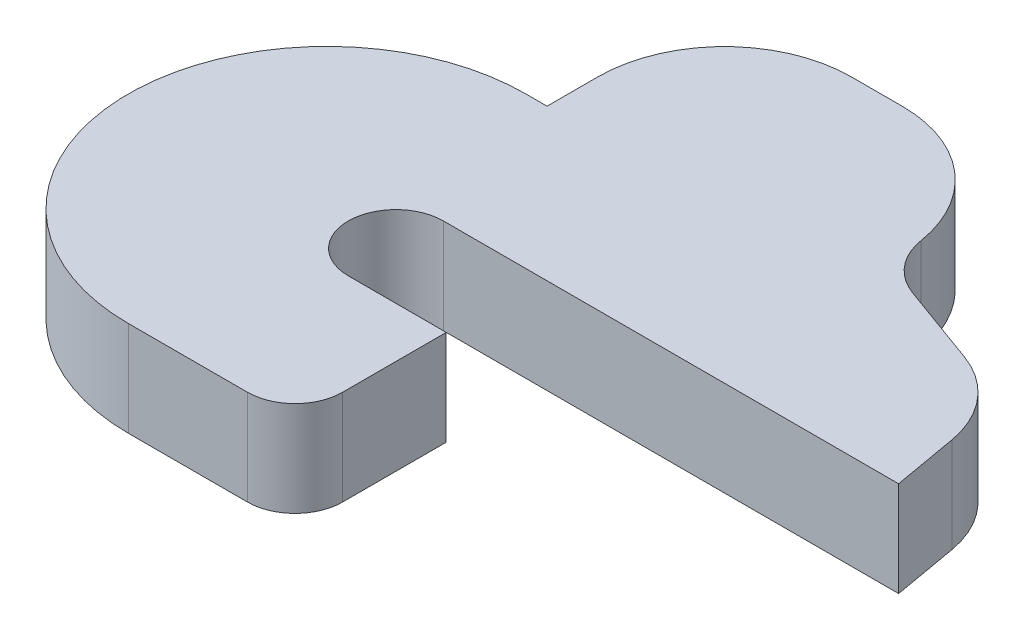
ISO-10303-21;
HEADER;
FILE_DESCRIPTION(('STEP AP214'),'2;1');
FILE_NAME('part.step','',(''),(''),'','','');
FILE_SCHEMA(('AUTOMOTIVE_DESIGN { 1 0 10303 214 1 1 1 1 }'));
ENDSEC;
DATA;
#1=APPLICATION_CONTEXT('core data for automotive mechanical design processes');
#2=APPLICATION_PROTOCOL_DEFINITION('international standard','automotive_design',2000,#1);
#3=PRODUCT_CONTEXT('',#1,'mechanical');
#4=PRODUCT('Part','Part','',(#3));
#5=PRODUCT_RELATED_PRODUCT_CATEGORY('part','',(#4));
#6=PRODUCT_DEFINITION_FORMATION('','',#4);
#7=PRODUCT_DEFINITION_CONTEXT('part definition',#1,'design');
#8=PRODUCT_DEFINITION('design','',#6,#7);
#9=PRODUCT_DEFINITION_SHAPE('','',#8);
#10=(LENGTH_UNIT() NAMED_UNIT(*) SI_UNIT(.MILLI.,.METRE.));
#11=(NAMED_UNIT(*) PLANE_ANGLE_UNIT() SI_UNIT($,.RADIAN.));
#12=(NAMED_UNIT(*) SI_UNIT($,.STERADIAN.) SOLID_ANGLE_UNIT());
#13=UNCERTAINTY_MEASURE_WITH_UNIT(LENGTH_MEASURE(1.E-05),#10,'distance_accuracy_value','');
#14=(GEOMETRIC_REPRESENTATION_CONTEXT(3) GLOBAL_UNCERTAINTY_ASSIGNED_CONTEXT((#13)) GLOBAL_UNIT_ASSIGNED_CONTEXT((#10,
#11,#12)) REPRESENTATION_CONTEXT('',''));
#15=CARTESIAN_POINT('',(0.,0.,0.));
#16=DIRECTION('',(0.,0.,1.));
#17=DIRECTION('',(1.,0.,0.));
#18=AXIS2_PLACEMENT_3D('',#15,#16,#17);
#19=CARTESIAN_POINT('',(0.,3.,3.27));
#20=DIRECTION('',(-1.,0.,0.));
#21=DIRECTION('',(0.,0.,1.));
#22=AXIS2_PLACEMENT_3D('',#19,#20,#21);
#23=PLANE('',#22);
#24=DIRECTION('',(0.,0.,-1.));
#25=VECTOR('',#24,1.);
#26=CARTESIAN_POINT('',(0.,0.,3.27));
#27=LINE('',#26,#25);
#28=CARTESIAN_POINT('',(0.,0.,3.27));
#29=VERTEX_POINT('',#28);
#30=CARTESIAN_POINT('',(0.,0.,0.));
#31=VERTEX_POINT('',#30);
#32=EDGE_CURVE('E177',#29,#31,#27,.T.);
#33=ORIENTED_EDGE('',*,*,#32,.T.);
#34=DIRECTION('',(0.,-1.,0.));
#35=VECTOR('',#34,1.);
#36=CARTESIAN_POINT('',(0.,3.,0.));
#37=LINE('',#36,#35);
#38=CARTESIAN_POINT('',(0.,3.,0.));
#39=VERTEX_POINT('',#38);
#40=EDGE_CURVE('E11',#39,#31,#37,.T.);
#41=ORIENTED_EDGE('',*,*,#40,.F.);
#42=DIRECTION('',(0.,0.,-1.));
#43=VECTOR('',#42,1.);
#44=CARTESIAN_POINT('',(0.,3.,3.27));
#45=LINE('',#44,#43);
#46=CARTESIAN_POINT('',(0.,3.,3.27));
#47=VERTEX_POINT('',#46);
#48=EDGE_CURVE('E207',#47,#39,#45,.T.);
#49=ORIENTED_EDGE('',*,*,#48,.F.);
#50=DIRECTION('',(0.,-1.,0.));
#51=VECTOR('',#50,1.);
#52=CARTESIAN_POINT('',(0.,3.,3.27));
#53=LINE('',#52,#51);
#54=EDGE_CURVE('E173',#47,#29,#53,.T.);
#55=ORIENTED_EDGE('',*,*,#54,.T.);
#56=EDGE_LOOP('',(#33,#41,#49,#55));
#57=FACE_BOUND('',#56,.T.);
#58=ADVANCED_FACE('F33',(#57),#23,.F.);
#59=CARTESIAN_POINT('',(0.,3.,0.));
#60=DIRECTION('',(0.,0.,1.));
#61=DIRECTION('',(1.,0.,0.));
#62=AXIS2_PLACEMENT_3D('',#59,#60,#61);
#63=PLANE('',#62);
#64=DIRECTION('',(-1.,0.,0.));
#65=VECTOR('',#64,1.);
#66=CARTESIAN_POINT('',(0.,0.,0.));
#67=LINE('',#66,#65);
#68=CARTESIAN_POINT('',(-3.09,0.,0.));
#69=VERTEX_POINT('',#68);
#70=EDGE_CURVE('E180',#31,#69,#67,.T.);
#71=ORIENTED_EDGE('',*,*,#70,.T.);
#72=DIRECTION('',(0.,-1.,0.));
#73=VECTOR('',#72,1.);
#74=CARTESIAN_POINT('',(-3.09,3.,0.));
#75=LINE('',#74,#73);
#76=CARTESIAN_POINT('',(-3.09,3.,0.));
#77=VERTEX_POINT('',#76);
#78=EDGE_CURVE('E41',#77,#69,#75,.T.);
#79=ORIENTED_EDGE('',*,*,#78,.F.);
#80=DIRECTION('',(-1.,0.,0.));
#81=VECTOR('',#80,1.);
#82=CARTESIAN_POINT('',(0.,3.,0.));
#83=LINE('',#82,#81);
#84=EDGE_CURVE('E116',#39,#77,#83,.T.);
#85=ORIENTED_EDGE('',*,*,#84,.F.);
#86=ORIENTED_EDGE('',*,*,#40,.T.);
#87=EDGE_LOOP('',(#71,#79,#85,#86));
#88=FACE_BOUND('',#87,.T.);
#89=ADVANCED_FACE('F305',(#88),#63,.F.);
#90=CARTESIAN_POINT('',(-3.09,3.,-1.5));
#91=DIRECTION('',(0.,-1.,0.));
#92=DIRECTION('',(0.,0.,-1.));
#93=AXIS2_PLACEMENT_3D('',#90,#91,#92);
#94=CYLINDRICAL_SURFACE('',#93,1.5);
#95=CARTESIAN_POINT('',(-3.09,0.,-1.5));
#96=DIRECTION('',(0.,-1.,0.));
#97=DIRECTION('',(0.,0.,-1.));
#98=AXIS2_PLACEMENT_3D('',#95,#96,#97);
#99=CIRCLE('',#98,1.5);
#100=CARTESIAN_POINT('',(-3.09,0.,-3.));
#101=VERTEX_POINT('',#100);
#102=EDGE_CURVE('E182',#69,#101,#99,.T.);
#103=ORIENTED_EDGE('',*,*,#102,.T.);
#104=DIRECTION('',(0.,-1.,0.));
#105=VECTOR('',#104,1.);
#106=CARTESIAN_POINT('',(-3.09,3.,-3.));
#107=LINE('',#106,#105);
#108=CARTESIAN_POINT('',(-3.09,3.,-3.));
#109=VERTEX_POINT('',#108);
#110=EDGE_CURVE('E238',#109,#101,#107,.T.);
#111=ORIENTED_EDGE('',*,*,#110,.F.);
#112=CARTESIAN_POINT('',(-3.09,3.,-1.5));
#113=DIRECTION('',(0.,-1.,0.));
#114=DIRECTION('',(0.,0.,-1.));
#115=AXIS2_PLACEMENT_3D('',#112,#113,#114);
#116=CIRCLE('',#115,1.5);
#117=EDGE_CURVE('E246',#77,#109,#116,.T.);
#118=ORIENTED_EDGE('',*,*,#117,.F.);
#119=ORIENTED_EDGE('',*,*,#78,.T.);
#120=EDGE_LOOP('',(#103,#111,#118,#119));
#121=FACE_BOUND('',#120,.T.);
#122=ADVANCED_FACE('F244',(#121),#94,.F.);
#123=CARTESIAN_POINT('',(-3.09,3.,-3.));
#124=DIRECTION('',(0.,0.,-1.));
#125=DIRECTION('',(-1.,0.,0.));
#126=AXIS2_PLACEMENT_3D('',#123,#124,#125);
#127=PLANE('',#126);
#128=DIRECTION('',(1.,0.,0.));
#129=VECTOR('',#128,1.);
#130=CARTESIAN_POINT('',(-3.09,0.,-3.));
#131=LINE('',#130,#129);
#132=CARTESIAN_POINT('',(11.27,0.,-3.));
#133=VERTEX_POINT('',#132);
#134=EDGE_CURVE('E184',#101,#133,#131,.T.);
#135=ORIENTED_EDGE('',*,*,#134,.T.);
#136=DIRECTION('',(0.,-1.,0.));
#137=VECTOR('',#136,1.);
#138=CARTESIAN_POINT('',(11.27,3.,-3.));
#139=LINE('',#138,#137);
#140=CARTESIAN_POINT('',(11.27,3.,-3.));
#141=VERTEX_POINT('',#140);
#142=EDGE_CURVE('E235',#141,#133,#139,.T.);
#143=ORIENTED_EDGE('',*,*,#142,.F.);
#144=DIRECTION('',(1.,0.,0.));
#145=VECTOR('',#144,1.);
#146=CARTESIAN_POINT('',(-3.09,3.,-3.));
#147=LINE('',#146,#145);
#148=EDGE_CURVE('E264',#109,#141,#147,.T.);
#149=ORIENTED_EDGE('',*,*,#148,.F.);
#150=ORIENTED_EDGE('',*,*,#110,.T.);
#151=EDGE_LOOP('',(#135,#143,#149,#150));
#152=FACE_BOUND('',#151,.T.);
#153=ADVANCED_FACE('F255',(#152),#127,.F.);
#154=CARTESIAN_POINT('',(11.27,3.,-3.));
#155=DIRECTION('',(-0.984807753012207,0.,0.173648177666936));
#156=DIRECTION('',(0.173648177666936,0.,0.984807753012207));
#157=AXIS2_PLACEMENT_3D('',#154,#155,#156);
#158=PLANE('',#157);
#159=DIRECTION('',(-0.173648177666936,0.,-0.984807753012207));
#160=VECTOR('',#159,1.);
#161=CARTESIAN_POINT('',(11.27,0.,-3.));
#162=LINE('',#161,#160);
#163=CARTESIAN_POINT('',(10.9088221154867,0.,-5.04834157008812));
#164=VERTEX_POINT('',#163);
#165=EDGE_CURVE('E186',#133,#164,#162,.T.);
#166=ORIENTED_EDGE('',*,*,#165,.T.);
#167=DIRECTION('',(0.,-1.,0.));
#168=VECTOR('',#167,1.);
#169=CARTESIAN_POINT('',(10.9088221154867,3.,-5.04834157008812));
#170=LINE('',#169,#168);
#171=CARTESIAN_POINT('',(10.9088221154867,3.,-5.04834157008812));
#172=VERTEX_POINT('',#171);
#173=EDGE_CURVE('E232',#172,#164,#170,.T.);
#174=ORIENTED_EDGE('',*,*,#173,.F.);
#175=DIRECTION('',(-0.173648177666936,0.,-0.984807753012207));
#176=VECTOR('',#175,1.);
#177=CARTESIAN_POINT('',(11.27,3.,-3.));
#178=LINE('',#177,#176);
#179=EDGE_CURVE('E261',#141,#172,#178,.T.);
#180=ORIENTED_EDGE('',*,*,#179,.F.);
#181=ORIENTED_EDGE('',*,*,#142,.T.);
#182=EDGE_LOOP('',(#166,#174,#180,#181));
#183=FACE_BOUND('',#182,.T.);
#184=ADVANCED_FACE('F259',(#183),#158,.F.);
#185=CARTESIAN_POINT('',(7.75743730584765,3.,-4.49266740155393));
#186=DIRECTION('',(0.,-1.,0.));
#187=DIRECTION('',(0.,0.,-1.));
#188=AXIS2_PLACEMENT_3D('',#185,#186,#187);
#189=CYLINDRICAL_SURFACE('',#188,3.2);
#190=CARTESIAN_POINT('',(7.75743730584765,0.,-4.49266740155393));
#191=DIRECTION('',(0.,1.,0.));
#192=DIRECTION('',(0.,0.,1.));
#193=AXIS2_PLACEMENT_3D('',#190,#191,#192);
#194=CIRCLE('',#193,3.2);
#195=CARTESIAN_POINT('',(8.85103258853848,0.,-7.5));
#196=VERTEX_POINT('',#195);
#197=EDGE_CURVE('E188',#164,#196,#194,.T.);
#198=ORIENTED_EDGE('',*,*,#197,.T.);
#199=DIRECTION('',(0.,-1.,0.));
#200=VECTOR('',#199,1.);
#201=CARTESIAN_POINT('',(8.85103258853848,3.,-7.5));
#202=LINE('',#201,#200);
#203=CARTESIAN_POINT('',(8.85103258853848,3.,-7.5));
#204=VERTEX_POINT('',#203);
#205=EDGE_CURVE('E229',#204,#196,#202,.T.);
#206=ORIENTED_EDGE('',*,*,#205,.F.);
#207=CARTESIAN_POINT('',(7.75743730584765,3.,-4.49266740155393));
#208=DIRECTION('',(0.,1.,0.));
#209=DIRECTION('',(0.,0.,1.));
#210=AXIS2_PLACEMENT_3D('',#207,#208,#209);
#211=CIRCLE('',#210,3.2);
#212=EDGE_CURVE('E263',#172,#204,#211,.T.);
#213=ORIENTED_EDGE('',*,*,#212,.F.);
#214=ORIENTED_EDGE('',*,*,#173,.T.);
#215=EDGE_LOOP('',(#198,#206,#213,#214));
#216=FACE_BOUND('',#215,.T.);
#217=ADVANCED_FACE('F318',(#216),#189,.T.);
#218=CARTESIAN_POINT('',(6.27,3.,-8.43857429163487));
#219=DIRECTION('',(-0.341748525840883,0.,0.939791437014396));
#220=DIRECTION('',(0.939791437014396,0.,0.341748525840883));
#221=AXIS2_PLACEMENT_3D('',#218,#219,#220);
#222=PLANE('',#221);
#223=DIRECTION('',(-0.939791437014396,0.,-0.341748525840883));
#224=VECTOR('',#223,1.);
#225=CARTESIAN_POINT('',(6.27,0.,-8.43857429163487));
#226=LINE('',#225,#224);
#227=CARTESIAN_POINT('',(6.27,0.,-8.43857429163487));
#228=VERTEX_POINT('',#227);
#229=EDGE_CURVE('E190',#196,#228,#226,.T.);
#230=ORIENTED_EDGE('',*,*,#229,.T.);
#231=DIRECTION('',(0.,-1.,0.));
#232=VECTOR('',#231,1.);
#233=CARTESIAN_POINT('',(6.27,3.,-8.43857429163487));
#234=LINE('',#233,#232);
#235=CARTESIAN_POINT('',(6.27,3.,-8.43857429163487));
#236=VERTEX_POINT('',#235);
#237=EDGE_CURVE('E226',#236,#228,#234,.T.);
#238=ORIENTED_EDGE('',*,*,#237,.F.);
#239=DIRECTION('',(-0.939791437014396,0.,-0.341748525840883));
#240=VECTOR('',#239,1.);
#241=CARTESIAN_POINT('',(6.27,3.,-8.43857429163487));
#242=LINE('',#241,#240);
#243=EDGE_CURVE('E266',#204,#236,#242,.T.);
#244=ORIENTED_EDGE('',*,*,#243,.F.);
#245=ORIENTED_EDGE('',*,*,#205,.T.);
#246=EDGE_LOOP('',(#230,#238,#244,#245));
#247=FACE_BOUND('',#246,.T.);
#248=ADVANCED_FACE('F321',(#247),#222,.F.);
#249=CARTESIAN_POINT('',(6.95349705168177,3.,-10.3181571656637));
#250=DIRECTION('',(0.,-1.,0.));
#251=DIRECTION('',(0.,0.,-1.));
#252=AXIS2_PLACEMENT_3D('',#249,#250,#251);
#253=CYLINDRICAL_SURFACE('',#252,2.);
#254=CARTESIAN_POINT('',(6.95349705168177,0.,-10.3181571656637));
#255=DIRECTION('',(0.,-1.,0.));
#256=DIRECTION('',(0.,0.,-1.));
#257=AXIS2_PLACEMENT_3D('',#254,#255,#256);
#258=CIRCLE('',#257,2.);
#259=CARTESIAN_POINT('',(4.97862721098619,0.,-10.0021047771091));
#260=VERTEX_POINT('',#259);
#261=EDGE_CURVE('E192',#228,#260,#258,.T.);
#262=ORIENTED_EDGE('',*,*,#261,.T.);
#263=DIRECTION('',(0.,-1.,0.));
#264=VECTOR('',#263,1.);
#265=CARTESIAN_POINT('',(4.97862721098619,3.,-10.0021047771091));
#266=LINE('',#265,#264);
#267=CARTESIAN_POINT('',(4.97862721098619,3.,-10.0021047771091));
#268=VERTEX_POINT('',#267);
#269=EDGE_CURVE('E223',#268,#260,#266,.T.);
#270=ORIENTED_EDGE('',*,*,#269,.F.);
#271=CARTESIAN_POINT('',(6.95349705168177,3.,-10.3181571656637));
#272=DIRECTION('',(0.,-1.,0.));
#273=DIRECTION('',(0.,0.,-1.));
#274=AXIS2_PLACEMENT_3D('',#271,#272,#273);
#275=CIRCLE('',#274,2.);
#276=EDGE_CURVE('E272',#236,#268,#275,.T.);
#277=ORIENTED_EDGE('',*,*,#276,.F.);
#278=ORIENTED_EDGE('',*,*,#237,.T.);
#279=EDGE_LOOP('',(#262,#270,#277,#278));
#280=FACE_BOUND('',#279,.T.);
#281=ADVANCED_FACE('F325',(#280),#253,.F.);
#282=CARTESIAN_POINT('',(1.02888752959505,3.,-9.37));
#283=DIRECTION('',(0.,-1.,0.));
#284=DIRECTION('',(0.,0.,-1.));
#285=AXIS2_PLACEMENT_3D('',#282,#283,#284);
#286=CYLINDRICAL_SURFACE('',#285,4.);
#287=CARTESIAN_POINT('',(1.02888752959505,0.,-9.37));
#288=DIRECTION('',(0.,1.,0.));
#289=DIRECTION('',(0.,0.,-1.));
#290=AXIS2_PLACEMENT_3D('',#287,#288,#289);
#291=CIRCLE('',#290,4.);
#292=CARTESIAN_POINT('',(1.02888752959505,0.,-13.37));
#293=VERTEX_POINT('',#292);
#294=EDGE_CURVE('E194',#260,#293,#291,.T.);
#295=ORIENTED_EDGE('',*,*,#294,.T.);
#296=DIRECTION('',(0.,-1.,0.));
#297=VECTOR('',#296,1.);
#298=CARTESIAN_POINT('',(1.02888752959505,3.,-13.37));
#299=LINE('',#298,#297);
#300=CARTESIAN_POINT('',(1.02888752959505,3.,-13.37));
#301=VERTEX_POINT('',#300);
#302=EDGE_CURVE('E220',#301,#293,#299,.T.);
#303=ORIENTED_EDGE('',*,*,#302,.F.);
#304=CARTESIAN_POINT('',(1.02888752959505,3.,-9.37));
#305=DIRECTION('',(0.,1.,0.));
#306=DIRECTION('',(0.,0.,-1.));
#307=AXIS2_PLACEMENT_3D('',#304,#305,#306);
#308=CIRCLE('',#307,4.);
#309=EDGE_CURVE('E274',#268,#301,#308,.T.);
#310=ORIENTED_EDGE('',*,*,#309,.F.);
#311=ORIENTED_EDGE('',*,*,#269,.T.);
#312=EDGE_LOOP('',(#295,#303,#310,#311));
#313=FACE_BOUND('',#312,.T.);
#314=ADVANCED_FACE('F329',(#313),#286,.T.);
#315=CARTESIAN_POINT('',(1.02888752959504,3.,-13.37));
#316=DIRECTION('',(0.,0.,1.));
#317=DIRECTION('',(1.,0.,0.));
#318=AXIS2_PLACEMENT_3D('',#315,#316,#317);
#319=PLANE('',#318);
#320=DIRECTION('',(-1.,0.,0.));
#321=VECTOR('',#320,1.);
#322=CARTESIAN_POINT('',(1.02888752959504,0.,-13.37));
#323=LINE('',#322,#321);
#324=CARTESIAN_POINT('',(-0.590000000000001,0.,-13.37));
#325=VERTEX_POINT('',#324);
#326=EDGE_CURVE('E196',#293,#325,#323,.T.);
#327=ORIENTED_EDGE('',*,*,#326,.T.);
#328=DIRECTION('',(0.,-1.,0.));
#329=VECTOR('',#328,1.);
#330=CARTESIAN_POINT('',(-0.590000000000001,3.,-13.37));
#331=LINE('',#330,#329);
#332=CARTESIAN_POINT('',(-0.590000000000001,3.,-13.37));
#333=VERTEX_POINT('',#332);
#334=EDGE_CURVE('E217',#333,#325,#331,.T.);
#335=ORIENTED_EDGE('',*,*,#334,.F.);
#336=DIRECTION('',(-1.,0.,0.));
#337=VECTOR('',#336,1.);
#338=CARTESIAN_POINT('',(1.02888752959504,3.,-13.37));
#339=LINE('',#338,#337);
#340=EDGE_CURVE('E276',#301,#333,#339,.T.);
#341=ORIENTED_EDGE('',*,*,#340,.F.);
#342=ORIENTED_EDGE('',*,*,#302,.T.);
#343=EDGE_LOOP('',(#327,#335,#341,#342));
#344=FACE_BOUND('',#343,.T.);
#345=ADVANCED_FACE('F333',(#344),#319,.F.);
#346=CARTESIAN_POINT('',(-0.59,3.,-9.37));
#347=DIRECTION('',(0.,-1.,0.));
#348=DIRECTION('',(0.,0.,-1.));
#349=AXIS2_PLACEMENT_3D('',#346,#347,#348);
#350=CYLINDRICAL_SURFACE('',#349,4.);
#351=CARTESIAN_POINT('',(-0.59,0.,-9.37));
#352=DIRECTION('',(0.,1.,0.));
#353=DIRECTION('',(0.,0.,1.));
#354=AXIS2_PLACEMENT_3D('',#351,#352,#353);
#355=CIRCLE('',#354,4.);
#356=CARTESIAN_POINT('',(-4.59,0.,-9.37));
#357=VERTEX_POINT('',#356);
#358=EDGE_CURVE('E198',#325,#357,#355,.T.);
#359=ORIENTED_EDGE('',*,*,#358,.T.);
#360=DIRECTION('',(0.,-1.,0.));
#361=VECTOR('',#360,1.);
#362=CARTESIAN_POINT('',(-4.59,3.,-9.37));
#363=LINE('',#362,#361);
#364=CARTESIAN_POINT('',(-4.59,3.,-9.37));
#365=VERTEX_POINT('',#364);
#366=EDGE_CURVE('E214',#365,#357,#363,.T.);
#367=ORIENTED_EDGE('',*,*,#366,.F.);
#368=CARTESIAN_POINT('',(-0.59,3.,-9.37));
#369=DIRECTION('',(0.,1.,0.));
#370=DIRECTION('',(0.,0.,1.));
#371=AXIS2_PLACEMENT_3D('',#368,#369,#370);
#372=CIRCLE('',#371,4.);
#373=EDGE_CURVE('E278',#333,#365,#372,.T.);
#374=ORIENTED_EDGE('',*,*,#373,.F.);
#375=ORIENTED_EDGE('',*,*,#334,.T.);
#376=EDGE_LOOP('',(#359,#367,#374,#375));
#377=FACE_BOUND('',#376,.T.);
#378=ADVANCED_FACE('F337',(#377),#350,.T.);
#379=CARTESIAN_POINT('',(-4.59,3.,-9.37));
#380=DIRECTION('',(1.,0.,0.));
#381=DIRECTION('',(0.,0.,-1.));
#382=AXIS2_PLACEMENT_3D('',#379,#380,#381);
#383=PLANE('',#382);
#384=DIRECTION('',(0.,0.,1.));
#385=VECTOR('',#384,1.);
#386=CARTESIAN_POINT('',(-4.59,0.,-9.37));
#387=LINE('',#386,#385);
#388=CARTESIAN_POINT('',(-4.59,0.,-7.77));
#389=VERTEX_POINT('',#388);
#390=EDGE_CURVE('E200',#357,#389,#387,.T.);
#391=ORIENTED_EDGE('',*,*,#390,.T.);
#392=DIRECTION('',(0.,-1.,0.));
#393=VECTOR('',#392,1.);
#394=CARTESIAN_POINT('',(-4.59,3.,-7.77));
#395=LINE('',#394,#393);
#396=CARTESIAN_POINT('',(-4.59,3.,-7.77));
#397=VERTEX_POINT('',#396);
#398=EDGE_CURVE('E211',#397,#389,#395,.T.);
#399=ORIENTED_EDGE('',*,*,#398,.F.);
#400=DIRECTION('',(0.,0.,1.));
#401=VECTOR('',#400,1.);
#402=CARTESIAN_POINT('',(-4.59,3.,-9.37));
#403=LINE('',#402,#401);
#404=EDGE_CURVE('E280',#365,#397,#403,.T.);
#405=ORIENTED_EDGE('',*,*,#404,.F.);
#406=ORIENTED_EDGE('',*,*,#366,.T.);
#407=EDGE_LOOP('',(#391,#399,#405,#406));
#408=FACE_BOUND('',#407,.T.);
#409=ADVANCED_FACE('F286',(#408),#383,.F.);
#410=CARTESIAN_POINT('',(-4.59,3.,-7.77));
#411=DIRECTION('',(0.,0.,1.));
#412=DIRECTION('',(1.,0.,0.));
#413=AXIS2_PLACEMENT_3D('',#410,#411,#412);
#414=PLANE('',#413);
#415=DIRECTION('',(-1.,0.,0.));
#416=VECTOR('',#415,1.);
#417=CARTESIAN_POINT('',(-4.59,0.,-7.77));
#418=LINE('',#417,#416);
#419=CARTESIAN_POINT('',(-5.26,0.,-7.77));
#420=VERTEX_POINT('',#419);
#421=EDGE_CURVE('E202',#389,#420,#418,.T.);
#422=ORIENTED_EDGE('',*,*,#421,.T.);
#423=DIRECTION('',(0.,-1.,0.));
#424=VECTOR('',#423,1.);
#425=CARTESIAN_POINT('',(-5.26,3.,-7.77));
#426=LINE('',#425,#424);
#427=CARTESIAN_POINT('',(-5.26,3.,-7.77));
#428=VERTEX_POINT('',#427);
#429=EDGE_CURVE('E168',#428,#420,#426,.T.);
#430=ORIENTED_EDGE('',*,*,#429,.F.);
#431=DIRECTION('',(-1.,0.,0.));
#432=VECTOR('',#431,1.);
#433=CARTESIAN_POINT('',(-4.59,3.,-7.77));
#434=LINE('',#433,#432);
#435=EDGE_CURVE('E159',#397,#428,#434,.T.);
#436=ORIENTED_EDGE('',*,*,#435,.F.);
#437=ORIENTED_EDGE('',*,*,#398,.T.);
#438=EDGE_LOOP('',(#422,#430,#436,#437));
#439=FACE_BOUND('',#438,.T.);
#440=ADVANCED_FACE('F290',(#439),#414,.F.);
#441=CARTESIAN_POINT('',(-5.26,3.,-1.5));
#442=DIRECTION('',(0.,-1.,0.));
#443=DIRECTION('',(0.,0.,-1.));
#444=AXIS2_PLACEMENT_3D('',#441,#442,#443);
#445=CYLINDRICAL_SURFACE('',#444,6.27);
#446=CARTESIAN_POINT('',(-5.26,0.,-1.5));
#447=DIRECTION('',(0.,1.,0.));
#448=DIRECTION('',(0.,0.,1.));
#449=AXIS2_PLACEMENT_3D('',#446,#447,#448);
#450=CIRCLE('',#449,6.27);
#451=CARTESIAN_POINT('',(-5.26,0.,4.77));
#452=VERTEX_POINT('',#451);
#453=EDGE_CURVE('E167',#420,#452,#450,.T.);
#454=ORIENTED_EDGE('',*,*,#453,.T.);
#455=DIRECTION('',(0.,-1.,0.));
#456=VECTOR('',#455,1.);
#457=CARTESIAN_POINT('',(-5.26,3.,4.77));
#458=LINE('',#457,#456);
#459=CARTESIAN_POINT('',(-5.26,3.,4.77));
#460=VERTEX_POINT('',#459);
#461=EDGE_CURVE('E164',#460,#452,#458,.T.);
#462=ORIENTED_EDGE('',*,*,#461,.F.);
#463=CARTESIAN_POINT('',(-5.26,3.,-1.5));
#464=DIRECTION('',(0.,1.,0.));
#465=DIRECTION('',(0.,0.,1.));
#466=AXIS2_PLACEMENT_3D('',#463,#464,#465);
#467=CIRCLE('',#466,6.27);
#468=EDGE_CURVE('E153',#428,#460,#467,.T.);
#469=ORIENTED_EDGE('',*,*,#468,.F.);
#470=ORIENTED_EDGE('',*,*,#429,.T.);
#471=EDGE_LOOP('',(#454,#462,#469,#470));
#472=FACE_BOUND('',#471,.T.);
#473=ADVANCED_FACE('F165',(#472),#445,.T.);
#474=CARTESIAN_POINT('',(-5.26,3.,4.77));
#475=DIRECTION('',(0.,0.,-1.));
#476=DIRECTION('',(-1.,0.,0.));
#477=AXIS2_PLACEMENT_3D('',#474,#475,#476);
#478=PLANE('',#477);
#479=DIRECTION('',(1.,0.,0.));
#480=VECTOR('',#479,1.);
#481=CARTESIAN_POINT('',(-5.26,0.,4.77));
#482=LINE('',#481,#480);
#483=CARTESIAN_POINT('',(-1.5,0.,4.77));
#484=VERTEX_POINT('',#483);
#485=EDGE_CURVE('E102',#452,#484,#482,.T.);
#486=ORIENTED_EDGE('',*,*,#485,.T.);
#487=DIRECTION('',(0.,-1.,0.));
#488=VECTOR('',#487,1.);
#489=CARTESIAN_POINT('',(-1.5,3.,4.77));
#490=LINE('',#489,#488);
#491=CARTESIAN_POINT('',(-1.5,3.,4.77));
#492=VERTEX_POINT('',#491);
#493=EDGE_CURVE('E169',#492,#484,#490,.T.);
#494=ORIENTED_EDGE('',*,*,#493,.F.);
#495=DIRECTION('',(1.,0.,0.));
#496=VECTOR('',#495,1.);
#497=CARTESIAN_POINT('',(-5.26,3.,4.77));
#498=LINE('',#497,#496);
#499=EDGE_CURVE('E157',#460,#492,#498,.T.);
#500=ORIENTED_EDGE('',*,*,#499,.F.);
#501=ORIENTED_EDGE('',*,*,#461,.T.);
#502=EDGE_LOOP('',(#486,#494,#500,#501));
#503=FACE_BOUND('',#502,.T.);
#504=ADVANCED_FACE('F171',(#503),#478,.F.);
#505=CARTESIAN_POINT('',(-1.5,3.,3.27));
#506=DIRECTION('',(0.,-1.,0.));
#507=DIRECTION('',(0.,0.,-1.));
#508=AXIS2_PLACEMENT_3D('',#505,#506,#507);
#509=CYLINDRICAL_SURFACE('',#508,1.5);
#510=CARTESIAN_POINT('',(-1.5,0.,3.27));
#511=DIRECTION('',(0.,1.,0.));
#512=DIRECTION('',(0.,0.,1.));
#513=AXIS2_PLACEMENT_3D('',#510,#511,#512);
#514=CIRCLE('',#513,1.5);
#515=EDGE_CURVE('E108',#484,#29,#514,.T.);
#516=ORIENTED_EDGE('',*,*,#515,.T.);
#517=ORIENTED_EDGE('',*,*,#54,.F.);
#518=CARTESIAN_POINT('',(-1.5,3.,3.27));
#519=DIRECTION('',(0.,1.,0.));
#520=DIRECTION('',(0.,0.,1.));
#521=AXIS2_PLACEMENT_3D('',#518,#519,#520);
#522=CIRCLE('',#521,1.5);
#523=EDGE_CURVE('E49',#492,#47,#522,.T.);
#524=ORIENTED_EDGE('',*,*,#523,.F.);
#525=ORIENTED_EDGE('',*,*,#493,.T.);
#526=EDGE_LOOP('',(#516,#517,#524,#525));
#527=FACE_BOUND('',#526,.T.);
#528=ADVANCED_FACE('F294',(#527),#509,.T.);
#529=CARTESIAN_POINT('',(-3.09,3.,-1.5));
#530=DIRECTION('',(0.,-1.,0.));
#531=DIRECTION('',(0.,0.,-1.));
#532=AXIS2_PLACEMENT_3D('',#529,#530,#531);
#533=PLANE('',#532);
#534=ORIENTED_EDGE('',*,*,#48,.T.);
#535=ORIENTED_EDGE('',*,*,#84,.T.);
#536=ORIENTED_EDGE('',*,*,#117,.T.);
#537=ORIENTED_EDGE('',*,*,#148,.T.);
#538=ORIENTED_EDGE('',*,*,#179,.T.);
#539=ORIENTED_EDGE('',*,*,#212,.T.);
#540=ORIENTED_EDGE('',*,*,#243,.T.);
#541=ORIENTED_EDGE('',*,*,#276,.T.);
#542=ORIENTED_EDGE('',*,*,#309,.T.);
#543=ORIENTED_EDGE('',*,*,#340,.T.);
#544=ORIENTED_EDGE('',*,*,#373,.T.);
#545=ORIENTED_EDGE('',*,*,#404,.T.);
#546=ORIENTED_EDGE('',*,*,#435,.T.);
#547=ORIENTED_EDGE('',*,*,#468,.T.);
#548=ORIENTED_EDGE('',*,*,#499,.T.);
#549=ORIENTED_EDGE('',*,*,#523,.T.);
#550=EDGE_LOOP('',(#534,#535,#536,#537,#538,#539,#540,#541,#542,#543,#544,#545,#546,#547,#548,#549));
#551=FACE_BOUND('',#550,.T.);
#552=ADVANCED_FACE('F155',(#551),#533,.F.);
#553=CARTESIAN_POINT('',(-3.09,0.,-1.5));
#554=DIRECTION('',(0.,-1.,0.));
#555=DIRECTION('',(0.,0.,-1.));
#556=AXIS2_PLACEMENT_3D('',#553,#554,#555);
#557=PLANE('',#556);
#558=ORIENTED_EDGE('',*,*,#32,.F.);
#559=ORIENTED_EDGE('',*,*,#515,.F.);
#560=ORIENTED_EDGE('',*,*,#485,.F.);
#561=ORIENTED_EDGE('',*,*,#453,.F.);
#562=ORIENTED_EDGE('',*,*,#421,.F.);
#563=ORIENTED_EDGE('',*,*,#390,.F.);
#564=ORIENTED_EDGE('',*,*,#358,.F.);
#565=ORIENTED_EDGE('',*,*,#326,.F.);
#566=ORIENTED_EDGE('',*,*,#294,.F.);
#567=ORIENTED_EDGE('',*,*,#261,.F.);
#568=ORIENTED_EDGE('',*,*,#229,.F.);
#569=ORIENTED_EDGE('',*,*,#197,.F.);
#570=ORIENTED_EDGE('',*,*,#165,.F.);
#571=ORIENTED_EDGE('',*,*,#134,.F.);
#572=ORIENTED_EDGE('',*,*,#102,.F.);
#573=ORIENTED_EDGE('',*,*,#70,.F.);
#574=EDGE_LOOP('',(#558,#559,#560,#561,#562,#563,#564,#565,#566,#567,#568,#569,#570,#571,#572,#573));
#575=FACE_BOUND('',#574,.T.);
#576=ADVANCED_FACE('F250',(#575),#557,.T.);
#577=CLOSED_SHELL('',(#58,#89,#122,#153,#184,#217,#248,#281,#314,#345,#378,#409,#440,#473,#504,
#528,#552,#576));
#578=MANIFOLD_SOLID_BREP('B2',#577);
#579=ADVANCED_BREP_SHAPE_REPRESENTATION('',(#18,#578),#14);
#580=SHAPE_DEFINITION_REPRESENTATION(#9,#579);
ENDSEC;
END-ISO-10303-21;
